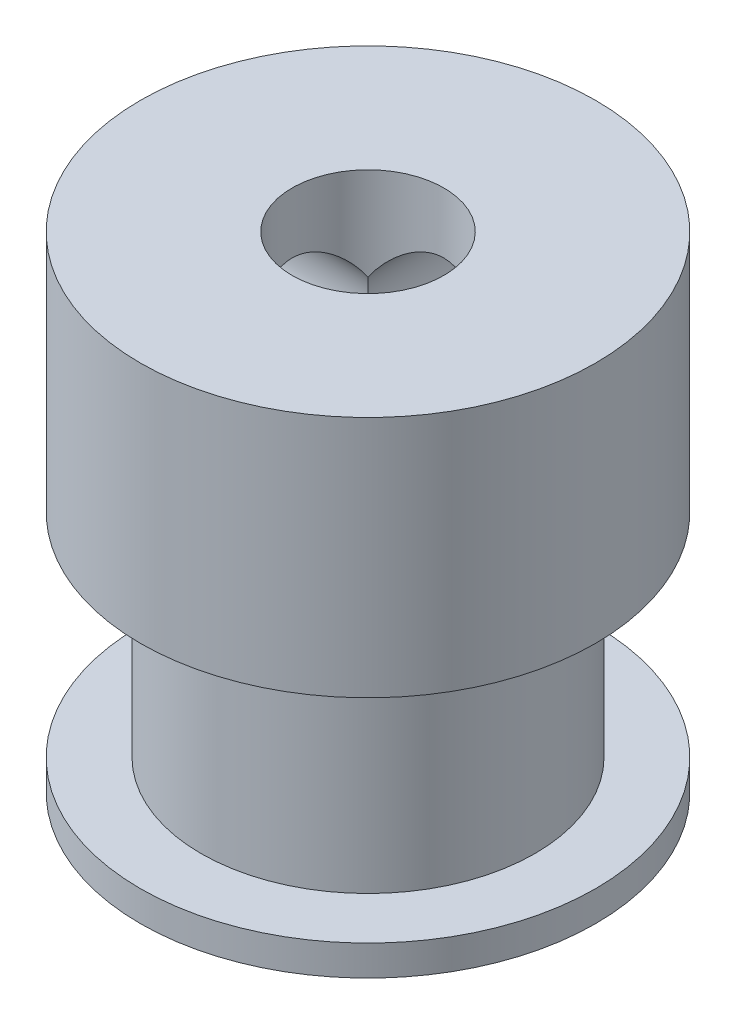
ISO-10303-21;
HEADER;
FILE_DESCRIPTION(('STEP AP214'),'2;1');
FILE_NAME('part.step','',(''),(''),'','','');
FILE_SCHEMA(('AUTOMOTIVE_DESIGN { 1 0 10303 214 1 1 1 1 }'));
ENDSEC;
DATA;
#1=APPLICATION_CONTEXT('core data for automotive mechanical design processes');
#2=APPLICATION_PROTOCOL_DEFINITION('international standard','automotive_design',2000,#1);
#3=PRODUCT_CONTEXT('',#1,'mechanical');
#4=PRODUCT('Part','Part','',(#3));
#5=PRODUCT_RELATED_PRODUCT_CATEGORY('part','',(#4));
#6=PRODUCT_DEFINITION_FORMATION('','',#4);
#7=PRODUCT_DEFINITION_CONTEXT('part definition',#1,'design');
#8=PRODUCT_DEFINITION('design','',#6,#7);
#9=PRODUCT_DEFINITION_SHAPE('','',#8);
#10=(LENGTH_UNIT() NAMED_UNIT(*) SI_UNIT(.MILLI.,.METRE.));
#11=(NAMED_UNIT(*) PLANE_ANGLE_UNIT() SI_UNIT($,.RADIAN.));
#12=(NAMED_UNIT(*) SI_UNIT($,.STERADIAN.) SOLID_ANGLE_UNIT());
#13=UNCERTAINTY_MEASURE_WITH_UNIT(LENGTH_MEASURE(1.E-05),#10,'distance_accuracy_value','');
#14=(GEOMETRIC_REPRESENTATION_CONTEXT(3) GLOBAL_UNCERTAINTY_ASSIGNED_CONTEXT((#13)) GLOBAL_UNIT_ASSIGNED_CONTEXT((#10,
#11,#12)) REPRESENTATION_CONTEXT('',''));
#15=CARTESIAN_POINT('',(0.,0.,0.));
#16=DIRECTION('',(0.,0.,1.));
#17=DIRECTION('',(1.,0.,0.));
#18=AXIS2_PLACEMENT_3D('',#15,#16,#17);
#19=CARTESIAN_POINT('',(0.,16.,0.));
#20=DIRECTION('',(0.,-1.,0.));
#21=DIRECTION('',(0.,0.,-1.));
#22=AXIS2_PLACEMENT_3D('',#19,#20,#21);
#23=CYLINDRICAL_SURFACE('',#22,7.5);
#24=CARTESIAN_POINT('',(0.,0.,0.));
#25=DIRECTION('',(0.,1.,0.));
#26=DIRECTION('',(0.,0.,1.));
#27=AXIS2_PLACEMENT_3D('',#24,#25,#26);
#28=CIRCLE('',#27,7.5);
#29=CARTESIAN_POINT('',(0.,0.,7.5));
#30=VERTEX_POINT('',#29);
#31=EDGE_CURVE('E72',#30,#30,#28,.T.);
#32=ORIENTED_EDGE('',*,*,#31,.T.);
#33=EDGE_LOOP('',(#32));
#34=FACE_BOUND('',#33,.T.);
#35=CARTESIAN_POINT('',(0.,1.,0.));
#36=DIRECTION('',(0.,-1.,0.));
#37=DIRECTION('',(0.,0.,-1.));
#38=AXIS2_PLACEMENT_3D('',#35,#36,#37);
#39=CIRCLE('',#38,7.5);
#40=CARTESIAN_POINT('',(0.,1.,-7.5));
#41=VERTEX_POINT('',#40);
#42=EDGE_CURVE('E102',#41,#41,#39,.T.);
#43=ORIENTED_EDGE('',*,*,#42,.T.);
#44=EDGE_LOOP('',(#43));
#45=FACE_BOUND('',#44,.T.);
#46=ADVANCED_FACE('F32',(#34,#45),#23,.T.);
#47=CARTESIAN_POINT('',(0.,0.,0.));
#48=DIRECTION('',(0.,1.,0.));
#49=DIRECTION('',(0.,0.,1.));
#50=AXIS2_PLACEMENT_3D('',#47,#48,#49);
#51=PLANE('',#50);
#52=CARTESIAN_POINT('',(0.,0.,0.));
#53=DIRECTION('',(0.,1.,0.));
#54=DIRECTION('',(0.,0.,1.));
#55=AXIS2_PLACEMENT_3D('',#52,#53,#54);
#56=CIRCLE('',#55,2.5);
#57=CARTESIAN_POINT('',(0.,0.,2.5));
#58=VERTEX_POINT('',#57);
#59=EDGE_CURVE('E88',#58,#58,#56,.T.);
#60=ORIENTED_EDGE('',*,*,#59,.T.);
#61=EDGE_LOOP('',(#60));
#62=FACE_BOUND('',#61,.T.);
#63=ORIENTED_EDGE('',*,*,#31,.F.);
#64=EDGE_LOOP('',(#63));
#65=FACE_BOUND('',#64,.T.);
#66=ADVANCED_FACE('F112',(#62,#65),#51,.F.);
#67=CARTESIAN_POINT('',(0.,1.,7.5));
#68=DIRECTION('',(0.,1.,0.));
#69=DIRECTION('',(0.,0.,1.));
#70=AXIS2_PLACEMENT_3D('',#67,#68,#69);
#71=PLANE('',#70);
#72=CARTESIAN_POINT('',(0.,1.,0.));
#73=DIRECTION('',(0.,-1.,0.));
#74=DIRECTION('',(0.,0.,-1.));
#75=AXIS2_PLACEMENT_3D('',#72,#73,#74);
#76=CIRCLE('',#75,5.5);
#77=CARTESIAN_POINT('',(0.,1.,-5.5));
#78=VERTEX_POINT('',#77);
#79=EDGE_CURVE('E99',#78,#78,#76,.T.);
#80=ORIENTED_EDGE('',*,*,#79,.T.);
#81=EDGE_LOOP('',(#80));
#82=FACE_BOUND('',#81,.T.);
#83=ORIENTED_EDGE('',*,*,#42,.F.);
#84=EDGE_LOOP('',(#83));
#85=FACE_BOUND('',#84,.T.);
#86=ADVANCED_FACE('F114',(#82,#85),#71,.T.);
#87=CARTESIAN_POINT('',(0.,0.,0.));
#88=DIRECTION('',(0.,-1.,0.));
#89=DIRECTION('',(0.,0.,-1.));
#90=AXIS2_PLACEMENT_3D('',#87,#88,#89);
#91=CYLINDRICAL_SURFACE('',#90,5.5);
#92=CARTESIAN_POINT('',(0.,8.,0.));
#93=DIRECTION('',(0.,-1.,0.));
#94=DIRECTION('',(0.,0.,-1.));
#95=AXIS2_PLACEMENT_3D('',#92,#93,#94);
#96=CIRCLE('',#95,5.5);
#97=CARTESIAN_POINT('',(0.,8.,-5.5));
#98=VERTEX_POINT('',#97);
#99=EDGE_CURVE('E96',#98,#98,#96,.T.);
#100=ORIENTED_EDGE('',*,*,#99,.T.);
#101=EDGE_LOOP('',(#100));
#102=FACE_BOUND('',#101,.T.);
#103=ORIENTED_EDGE('',*,*,#79,.F.);
#104=EDGE_LOOP('',(#103));
#105=FACE_BOUND('',#104,.T.);
#106=ADVANCED_FACE('F120',(#102,#105),#91,.T.);
#107=CARTESIAN_POINT('',(0.,8.,7.5));
#108=DIRECTION('',(0.,-1.,0.));
#109=DIRECTION('',(0.,0.,-1.));
#110=AXIS2_PLACEMENT_3D('',#107,#108,#109);
#111=PLANE('',#110);
#112=CARTESIAN_POINT('',(0.,8.,0.));
#113=DIRECTION('',(0.,-1.,0.));
#114=DIRECTION('',(0.,0.,-1.));
#115=AXIS2_PLACEMENT_3D('',#112,#113,#114);
#116=CIRCLE('',#115,7.5);
#117=CARTESIAN_POINT('',(0.,8.,-7.5));
#118=VERTEX_POINT('',#117);
#119=EDGE_CURVE('E91',#118,#118,#116,.T.);
#120=ORIENTED_EDGE('',*,*,#119,.T.);
#121=EDGE_LOOP('',(#120));
#122=FACE_BOUND('',#121,.T.);
#123=ORIENTED_EDGE('',*,*,#99,.F.);
#124=EDGE_LOOP('',(#123));
#125=FACE_BOUND('',#124,.T.);
#126=ADVANCED_FACE('F127',(#122,#125),#111,.T.);
#127=CARTESIAN_POINT('',(0.,16.,0.));
#128=DIRECTION('',(0.,1.,0.));
#129=DIRECTION('',(0.,0.,1.));
#130=AXIS2_PLACEMENT_3D('',#127,#128,#129);
#131=PLANE('',#130);
#132=CARTESIAN_POINT('',(0.,16.,0.));
#133=DIRECTION('',(0.,1.,0.));
#134=DIRECTION('',(0.,0.,1.));
#135=AXIS2_PLACEMENT_3D('',#132,#133,#134);
#136=CIRCLE('',#135,2.5);
#137=CARTESIAN_POINT('',(0.,16.,2.5));
#138=VERTEX_POINT('',#137);
#139=EDGE_CURVE('E62',#138,#138,#136,.T.);
#140=ORIENTED_EDGE('',*,*,#139,.F.);
#141=EDGE_LOOP('',(#140));
#142=FACE_BOUND('',#141,.T.);
#143=CARTESIAN_POINT('',(0.,16.,0.));
#144=DIRECTION('',(0.,1.,0.));
#145=DIRECTION('',(0.,0.,1.));
#146=AXIS2_PLACEMENT_3D('',#143,#144,#145);
#147=CIRCLE('',#146,7.5);
#148=CARTESIAN_POINT('',(0.,16.,7.5));
#149=VERTEX_POINT('',#148);
#150=EDGE_CURVE('E40',#149,#149,#147,.T.);
#151=ORIENTED_EDGE('',*,*,#150,.T.);
#152=EDGE_LOOP('',(#151));
#153=FACE_BOUND('',#152,.T.);
#154=ADVANCED_FACE('F125',(#142,#153),#131,.T.);
#155=CARTESIAN_POINT('',(-7.50000000000003,10.,0.));
#156=CARTESIAN_POINT('',(-7.49999833810164,10.0000026169349,-0.110254555832828));
#157=CARTESIAN_POINT('',(-7.49754486162152,10.0091476141897,-0.220537160221813));
#158=CARTESIAN_POINT('',(-7.48799573621659,10.0454212307387,-0.437925451354436));
#159=CARTESIAN_POINT('',(-7.48089785332586,10.0725585044261,-0.545029583319059));
#160=CARTESIAN_POINT('',(-7.46284333252791,10.143871666864,-0.752891589045285));
#161=CARTESIAN_POINT('',(-7.45189167130376,10.188025587666,-0.853657451015257));
#162=CARTESIAN_POINT('',(-7.42728699151678,10.2920372426666,-1.04635368639263));
#163=CARTESIAN_POINT('',(-7.4136337929518,10.3518960233593,-1.1382834704496));
#164=CARTESIAN_POINT('',(-7.38474614901995,10.4870835164134,-1.31282950373999));
#165=CARTESIAN_POINT('',(-7.36948467678682,10.5627086680083,-1.39521168986276));
#166=CARTESIAN_POINT('',(-7.33927409679592,10.7266484830634,-1.54628713660635));
#167=CARTESIAN_POINT('',(-7.32432502947244,10.8149647776175,-1.61497863495662));
#168=CARTESIAN_POINT('',(-7.29615537464373,11.0036482348254,-1.73786409243412));
#169=CARTESIAN_POINT('',(-7.28296888563239,11.1041963282617,-1.79178877736485));
#170=CARTESIAN_POINT('',(-7.26021477318188,11.3133401110924,-1.88187548076991));
#171=CARTESIAN_POINT('',(-7.25064648253265,11.4219343123314,-1.91804077451366));
#172=CARTESIAN_POINT('',(-7.236491158024,11.641495537825,-1.97076920226501));
#173=CARTESIAN_POINT('',(-7.23179647811491,11.7523535399307,-1.98775670244689));
#174=CARTESIAN_POINT('',(-7.22759830916371,11.9754376833065,-2.00297034705817));
#175=CARTESIAN_POINT('',(-7.22809385014446,12.0876635650241,-2.00119999705751));
#176=CARTESIAN_POINT('',(-7.23412378802031,12.3069854153741,-1.97928510002697));
#177=CARTESIAN_POINT('',(-7.23951735511532,12.4141371820385,-1.95965406064762));
#178=CARTESIAN_POINT('',(-7.25451013080689,12.6235683344562,-1.9033974872218));
#179=CARTESIAN_POINT('',(-7.26410967552613,12.7258473300753,-1.86677059492992));
#180=CARTESIAN_POINT('',(-7.28655661748387,12.9239681438086,-1.77714356965253));
#181=CARTESIAN_POINT('',(-7.29943942818704,13.0197243392863,-1.72396341137782));
#182=CARTESIAN_POINT('',(-7.32698229642445,13.2011341588515,-1.60286503823775));
#183=CARTESIAN_POINT('',(-7.34164270355187,13.2867857891565,-1.53494392224249));
#184=CARTESIAN_POINT('',(-7.37167510629864,13.4484889974548,-1.38366607263417));
#185=CARTESIAN_POINT('',(-7.38705471488831,13.5241363183149,-1.29987812728297));
#186=CARTESIAN_POINT('',(-7.41636381276316,13.6603887803503,-1.12061766820635));
#187=CARTESIAN_POINT('',(-7.43029324488555,13.7209933287024,-1.02514469420507));
#188=CARTESIAN_POINT('',(-7.45521820398294,13.8256179028246,-0.824598255497428));
#189=CARTESIAN_POINT('',(-7.4662007283356,13.8695647704486,-0.719484902551765));
#190=CARTESIAN_POINT('',(-7.48390044401,13.9390471888134,-0.503002294390372));
#191=CARTESIAN_POINT('',(-7.49061856733749,13.964586762724,-0.3916344119283));
#192=CARTESIAN_POINT('',(-7.49889158558384,13.9958948769178,-0.169254083145492));
#193=CARTESIAN_POINT('',(-7.50058997470959,14.0022130398509,-0.0583242376413571));
#194=CARTESIAN_POINT('',(-7.49904471691695,13.9964168357531,0.163010045901222));
#195=CARTESIAN_POINT('',(-7.49580158080353,13.9843043738942,0.273414537062138));
#196=CARTESIAN_POINT('',(-7.48483035496021,13.94244155254,0.488602449901804));
#197=CARTESIAN_POINT('',(-7.47718026546329,13.9129977538022,0.593449852027806));
#198=CARTESIAN_POINT('',(-7.45826294894139,13.8376640554921,0.796706971176088));
#199=CARTESIAN_POINT('',(-7.44699532996161,13.7917723737495,0.895115989216051));
#200=CARTESIAN_POINT('',(-7.42175660559528,13.6838261128195,1.08483847466798));
#201=CARTESIAN_POINT('',(-7.40773686604956,13.6214725332023,1.17597518846121));
#202=CARTESIAN_POINT('',(-7.37861452365563,13.482748369842,1.34668463539717));
#203=CARTESIAN_POINT('',(-7.3635117072752,13.4063750173989,1.4262550787992));
#204=CARTESIAN_POINT('',(-7.33339745866704,13.2392144225054,1.57388924478776));
#205=CARTESIAN_POINT('',(-7.31840061429312,13.1480814386048,1.64156519249818));
#206=CARTESIAN_POINT('',(-7.29066447182727,12.9554353039004,1.76067191185121));
#207=CARTESIAN_POINT('',(-7.27792507956316,12.8539225863777,1.81210336122163));
#208=CARTESIAN_POINT('',(-7.25629268373209,12.6439046929239,1.89687411586115));
#209=CARTESIAN_POINT('',(-7.24737748318008,12.5354441881824,1.9303181225396));
#210=CARTESIAN_POINT('',(-7.234398251268,12.3141606803253,1.97841205118793));
#211=CARTESIAN_POINT('',(-7.23033298020014,12.2013387996521,1.9930667760248));
#212=CARTESIAN_POINT('',(-7.22761744573588,11.9785052121162,2.00288989653717));
#213=CARTESIAN_POINT('',(-7.22879397743238,11.8685226797417,1.99868155618111));
#214=CARTESIAN_POINT('',(-7.23602396081087,11.65089648599,1.97234376000441));
#215=CARTESIAN_POINT('',(-7.24207728699438,11.5432527644994,1.95021476535028));
#216=CARTESIAN_POINT('',(-7.25827571073158,11.3341442478702,1.88902515699702));
#217=CARTESIAN_POINT('',(-7.26838885019644,11.2326381572678,1.85009661075583));
#218=CARTESIAN_POINT('',(-7.29156818136177,11.0375211694659,1.75651554562389));
#219=CARTESIAN_POINT('',(-7.30463483621363,10.9439115136995,1.70186056024619));
#220=CARTESIAN_POINT('',(-7.3327292144046,10.7642696405034,1.57648909268819));
#221=CARTESIAN_POINT('',(-7.3478033310169,10.6785414650238,1.50534729767912));
#222=CARTESIAN_POINT('',(-7.37795503783007,10.5200375483327,1.34983053511103));
#223=CARTESIAN_POINT('',(-7.3930326279844,10.4472649613312,1.26545235435877));
#224=CARTESIAN_POINT('',(-7.42187812403968,10.3152077623531,1.08367998108871));
#225=CARTESIAN_POINT('',(-7.4356111131455,10.2562449893507,0.986045961751808));
#226=CARTESIAN_POINT('',(-7.45983810102897,10.1556625840706,0.781888640416917));
#227=CARTESIAN_POINT('',(-7.47033417683594,10.1140318243364,0.675371094696325));
#228=CARTESIAN_POINT('',(-7.48554752513467,10.0547247145845,0.474374704881018));
#229=CARTESIAN_POINT('',(-7.49092770592601,10.0342506164075,0.380762016565062));
#230=CARTESIAN_POINT('',(-7.49815449036457,10.0068877938329,0.191439795317102));
#231=CARTESIAN_POINT('',(-7.50000144297273,9.99999772779998,0.0957304704048863));
#232=CARTESIAN_POINT('',(-7.50000000000003,10.,0.));
#233=B_SPLINE_CURVE_WITH_KNOTS('',3,(#155,#156,#157,#158,#159,#160,#161,#162,#163,#164,#165,
#166,#167,#168,#169,#170,#171,#172,#173,#174,#175,#176,#177,#178,#179,#180,#181,#182,#183,#184,
#185,#186,#187,#188,#189,#190,#191,#192,#193,#194,#195,#196,#197,#198,#199,#200,#201,#202,#203,
#204,#205,#206,#207,#208,#209,#210,#211,#212,#213,#214,#215,#216,#217,#218,#219,#220,#221,#222,
#223,#224,#225,#226,#227,#228,#229,#230,#231,#232),.UNSPECIFIED.,.T.,.F.,(4,2,2,2,2,2,2,2,2,2,2,
2,2,2,2,2,2,2,2,2,2,2,2,2,2,2,2,2,2,2,2,2,2,2,2,2,2,2,4),(0.,0.330412598949568,
0.660984243761449,0.991130552971931,1.32129886708675,1.65834897954967,1.99544244925149,
2.33832582523229,2.68114594129699,3.01622158250468,3.35123460404319,3.67691002045997,
4.0026114681294,4.33198673346498,4.6614268811763,5.00161259812322,5.34181171937597,
5.68348809603041,6.02508977190138,6.35682717524547,6.6885302892535,7.01453535642116,
7.34057575775614,7.6730028600455,8.00549568258887,8.34736496382788,8.68921998024107,
9.02906297699386,9.36881908663983,9.69743342403611,10.0260393052059,10.352107654483,
10.67822717123,11.0139433957139,11.3497412433245,11.692722522809,12.0354832614518,
12.3223981899334,12.6092847796638),.UNSPECIFIED.);
#234=CARTESIAN_POINT('',(-7.50000000000003,10.,0.));
#235=VERTEX_POINT('',#234);
#236=EDGE_CURVE('E56',#235,#235,#233,.T.);
#237=ORIENTED_EDGE('',*,*,#236,.T.);
#238=EDGE_LOOP('',(#237));
#239=FACE_BOUND('',#238,.T.);
#240=CARTESIAN_POINT('',(0.,14.,-7.5));
#241=CARTESIAN_POINT('',(-0.110254555832854,13.9999973830651,-7.49999833810162));
#242=CARTESIAN_POINT('',(-0.22053716022184,13.9908523858103,-7.49754486162151));
#243=CARTESIAN_POINT('',(-0.437925451354463,13.9545787692613,-7.4879957362166));
#244=CARTESIAN_POINT('',(-0.545029583319086,13.9274414955739,-7.48089785332586));
#245=CARTESIAN_POINT('',(-0.752891589045312,13.856128333136,-7.46284333252791));
#246=CARTESIAN_POINT('',(-0.853657451015285,13.811974412334,-7.45189167130375));
#247=CARTESIAN_POINT('',(-1.04635368639266,13.7079627573334,-7.42728699151678));
#248=CARTESIAN_POINT('',(-1.13828347044963,13.6481039766407,-7.4136337929518));
#249=CARTESIAN_POINT('',(-1.31282950374002,13.5129164835866,-7.38474614901995));
#250=CARTESIAN_POINT('',(-1.39521168986279,13.4372913319917,-7.36948467678681));
#251=CARTESIAN_POINT('',(-1.54628713660638,13.2733515169366,-7.33927409679591));
#252=CARTESIAN_POINT('',(-1.61497863495664,13.1850352223825,-7.32432502947243));
#253=CARTESIAN_POINT('',(-1.73786409243415,12.9963517651746,-7.29615537464372));
#254=CARTESIAN_POINT('',(-1.79178877736487,12.8958036717383,-7.28296888563239));
#255=CARTESIAN_POINT('',(-1.88187548076994,12.6866598889076,-7.26021477318187));
#256=CARTESIAN_POINT('',(-1.91804077451369,12.5780656876686,-7.25064648253265));
#257=CARTESIAN_POINT('',(-1.97076920226504,12.358504462175,-7.23649115802399));
#258=CARTESIAN_POINT('',(-1.98775670244692,12.2476464600693,-7.2317964781149));
#259=CARTESIAN_POINT('',(-2.0029703470582,12.0245623166935,-7.22759830916371));
#260=CARTESIAN_POINT('',(-2.00119999705753,11.9123364349759,-7.22809385014446));
#261=CARTESIAN_POINT('',(-1.97928510002699,11.6930145846259,-7.23412378802031));
#262=CARTESIAN_POINT('',(-1.95965406064765,11.5858628179615,-7.23951735511531));
#263=CARTESIAN_POINT('',(-1.90339748722183,11.3764316655438,-7.25451013080688));
#264=CARTESIAN_POINT('',(-1.86677059492995,11.2741526699247,-7.26410967552613));
#265=CARTESIAN_POINT('',(-1.77714356965256,11.0760318561914,-7.28655661748386));
#266=CARTESIAN_POINT('',(-1.72396341137784,10.9802756607137,-7.29943942818703));
#267=CARTESIAN_POINT('',(-1.60286503823777,10.7988658411485,-7.32698229642445));
#268=CARTESIAN_POINT('',(-1.53494392224251,10.7132142108435,-7.34164270355186));
#269=CARTESIAN_POINT('',(-1.38366607263419,10.5515110025452,-7.37167510629864));
#270=CARTESIAN_POINT('',(-1.29987812728299,10.475863681685,-7.38705471488831));
#271=CARTESIAN_POINT('',(-1.12061766820637,10.3396112196497,-7.41636381276316));
#272=CARTESIAN_POINT('',(-1.02514469420509,10.2790066712976,-7.43029324488555));
#273=CARTESIAN_POINT('',(-0.824598255497451,10.1743820971754,-7.45521820398293));
#274=CARTESIAN_POINT('',(-0.719484902551789,10.1304352295514,-7.4662007283356));
#275=CARTESIAN_POINT('',(-0.503002294390395,10.0609528111866,-7.48390044400999));
#276=CARTESIAN_POINT('',(-0.391634411928323,10.035413237276,-7.49061856733749));
#277=CARTESIAN_POINT('',(-0.169254083145515,10.0041051230822,-7.49889158558384));
#278=CARTESIAN_POINT('',(-0.0583242376413801,9.99778696014913,-7.50058997470959));
#279=CARTESIAN_POINT('',(0.163010045901199,10.0035831642469,-7.49904471691695));
#280=CARTESIAN_POINT('',(0.273414537062114,10.0156956261058,-7.49580158080353));
#281=CARTESIAN_POINT('',(0.48860244990178,10.05755844746,-7.48483035496021));
#282=CARTESIAN_POINT('',(0.593449852027783,10.0870022461978,-7.4771802654633));
#283=CARTESIAN_POINT('',(0.796706971176065,10.1623359445079,-7.45826294894139));
#284=CARTESIAN_POINT('',(0.895115989216027,10.2082276262505,-7.44699532996161));
#285=CARTESIAN_POINT('',(1.08483847466795,10.3161738871805,-7.42175660559529));
#286=CARTESIAN_POINT('',(1.17597518846118,10.3785274667977,-7.40773686604957));
#287=CARTESIAN_POINT('',(1.34668463539715,10.517251630158,-7.37861452365564));
#288=CARTESIAN_POINT('',(1.42625507879918,10.5936249826011,-7.3635117072752));
#289=CARTESIAN_POINT('',(1.57388924478774,10.7607855774946,-7.33339745866705));
#290=CARTESIAN_POINT('',(1.64156519249816,10.8519185613952,-7.31840061429312));
#291=CARTESIAN_POINT('',(1.76067191185118,11.0445646960996,-7.29066447182728));
#292=CARTESIAN_POINT('',(1.81210336122161,11.1460774136223,-7.27792507956316));
#293=CARTESIAN_POINT('',(1.89687411586112,11.3560953070761,-7.2562926837321));
#294=CARTESIAN_POINT('',(1.93031812253958,11.4645558118176,-7.24737748318009));
#295=CARTESIAN_POINT('',(1.97841205118791,11.6858393196748,-7.23439825126801));
#296=CARTESIAN_POINT('',(1.99306677602478,11.7986612003479,-7.23033298020014));
#297=CARTESIAN_POINT('',(2.00288989653714,12.0214947878838,-7.22761744573589));
#298=CARTESIAN_POINT('',(1.99868155618109,12.1314773202583,-7.22879397743239));
#299=CARTESIAN_POINT('',(1.97234376000439,12.34910351401,-7.23602396081087));
#300=CARTESIAN_POINT('',(1.95021476535025,12.4567472355006,-7.24207728699439));
#301=CARTESIAN_POINT('',(1.88902515699699,12.6658557521298,-7.25827571073158));
#302=CARTESIAN_POINT('',(1.8500966107558,12.7673618427322,-7.26838885019644));
#303=CARTESIAN_POINT('',(1.75651554562386,12.9624788305341,-7.29156818136178));
#304=CARTESIAN_POINT('',(1.70186056024617,13.0560884863005,-7.30463483621364));
#305=CARTESIAN_POINT('',(1.57648909268817,13.2357303594966,-7.3327292144046));
#306=CARTESIAN_POINT('',(1.50534729767909,13.3214585349762,-7.3478033310169));
#307=CARTESIAN_POINT('',(1.349830535111,13.4799624516673,-7.37795503783008));
#308=CARTESIAN_POINT('',(1.26545235435875,13.5527350386688,-7.39303262798441));
#309=CARTESIAN_POINT('',(1.08367998108868,13.6847922376469,-7.42187812403969));
#310=CARTESIAN_POINT('',(0.986045961751779,13.7437550106493,-7.43561111314551));
#311=CARTESIAN_POINT('',(0.781888640416889,13.8443374159294,-7.45983810102898));
#312=CARTESIAN_POINT('',(0.675371094696296,13.8859681756636,-7.47033417683594));
#313=CARTESIAN_POINT('',(0.47437470488099,13.9452752854155,-7.48554752513468));
#314=CARTESIAN_POINT('',(0.380762016565036,13.9657493835925,-7.49092770592602));
#315=CARTESIAN_POINT('',(0.191439795317076,13.9931122061671,-7.49815449036456));
#316=CARTESIAN_POINT('',(0.0957304704048603,14.0000022722,-7.5000014429727));
#317=CARTESIAN_POINT('',(0.,14.,-7.5));
#318=B_SPLINE_CURVE_WITH_KNOTS('',3,(#240,#241,#242,#243,#244,#245,#246,#247,#248,#249,#250,
#251,#252,#253,#254,#255,#256,#257,#258,#259,#260,#261,#262,#263,#264,#265,#266,#267,#268,#269,
#270,#271,#272,#273,#274,#275,#276,#277,#278,#279,#280,#281,#282,#283,#284,#285,#286,#287,#288,
#289,#290,#291,#292,#293,#294,#295,#296,#297,#298,#299,#300,#301,#302,#303,#304,#305,#306,#307,
#308,#309,#310,#311,#312,#313,#314,#315,#316,#317),.UNSPECIFIED.,.T.,.F.,(4,2,2,2,2,2,2,2,2,2,2,
2,2,2,2,2,2,2,2,2,2,2,2,2,2,2,2,2,2,2,2,2,2,2,2,2,2,2,4),(0.,0.330412598949569,0.66098424376145,
0.991130552971932,1.32129886708675,1.65834897954967,1.99544244925149,2.33832582523229,
2.681145941297,3.01622158250468,3.3512346040432,3.67691002045997,4.0026114681294,
4.33198673346498,4.6614268811763,5.00161259812322,5.34181171937597,5.68348809603041,
6.02508977190139,6.35682717524547,6.68853028925351,7.01453535642116,7.34057575775614,
7.6730028600455,8.00549568258887,8.34736496382789,8.68921998024107,9.02906297699387,
9.36881908663983,9.69743342403611,10.0260393052059,10.352107654483,10.67822717123,
11.0139433957139,11.3497412433245,11.692722522809,12.0354832614518,12.3223981899334,
12.6092847796638),.UNSPECIFIED.);
#319=CARTESIAN_POINT('',(0.,14.,-7.5));
#320=VERTEX_POINT('',#319);
#321=EDGE_CURVE('E60',#320,#320,#318,.T.);
#322=ORIENTED_EDGE('',*,*,#321,.T.);
#323=EDGE_LOOP('',(#322));
#324=FACE_BOUND('',#323,.T.);
#325=ORIENTED_EDGE('',*,*,#150,.F.);
#326=EDGE_LOOP('',(#325));
#327=FACE_BOUND('',#326,.T.);
#328=ORIENTED_EDGE('',*,*,#119,.F.);
#329=EDGE_LOOP('',(#328));
#330=FACE_BOUND('',#329,.T.);
#331=ADVANCED_FACE('F123',(#239,#324,#327,#330),#23,.T.);
#332=CARTESIAN_POINT('',(0.,0.,0.));
#333=DIRECTION('',(0.,1.,0.));
#334=DIRECTION('',(0.,0.,1.));
#335=AXIS2_PLACEMENT_3D('',#332,#333,#334);
#336=CYLINDRICAL_SURFACE('',#335,2.5);
#337=CARTESIAN_POINT('',(2.,12.,-1.5));
#338=CARTESIAN_POINT('',(1.9999899563842,11.9249189826114,-1.5000227575991));
#339=CARTESIAN_POINT('',(1.99572243014959,11.8497210739064,-1.50575588676017));
#340=CARTESIAN_POINT('',(1.97904350434638,11.7016854705704,-1.52759797098302));
#341=CARTESIAN_POINT('',(1.96660415938922,11.6288567781879,-1.54374252679463));
#342=CARTESIAN_POINT('',(1.9288828901246,11.4623945804914,-1.59078313764401));
#343=CARTESIAN_POINT('',(1.90063587852784,11.3703574929004,-1.62485949442395));
#344=CARTESIAN_POINT('',(1.83286412912234,11.1940318598387,-1.70094533012843));
#345=CARTESIAN_POINT('',(1.79330760683741,11.1097660503329,-1.74297705283046));
#346=CARTESIAN_POINT('',(1.68777756612173,10.9196603432195,-1.84624966659378));
#347=CARTESIAN_POINT('',(1.6174236371176,10.8170334258727,-1.90894188114929));
#348=CARTESIAN_POINT('',(1.45861935064739,10.6260231647878,-2.03287996747903));
#349=CARTESIAN_POINT('',(1.37018407682201,10.5376280578861,-2.0941269976447));
#350=CARTESIAN_POINT('',(1.19476026278806,10.3928950804225,-2.1979067439451));
#351=CARTESIAN_POINT('',(1.11093376146689,10.3336737173159,-2.24174680788007));
#352=CARTESIAN_POINT('',(0.932444755507561,10.2276340400337,-2.32165152523267));
#353=CARTESIAN_POINT('',(0.837799422094948,10.1807964517991,-2.35772824500368));
#354=CARTESIAN_POINT('',(0.655317082222546,10.1082870394193,-2.41415644696378));
#355=CARTESIAN_POINT('',(0.568853585755693,10.0804174354239,-2.43610736091393));
#356=CARTESIAN_POINT('',(0.391188052921989,10.036501304746,-2.47085912284979));
#357=CARTESIAN_POINT('',(0.29998863731262,10.02044831209,-2.48366497483986));
#358=CARTESIAN_POINT('',(0.115048335136525,10.0011419067099,-2.49907968883617));
#359=CARTESIAN_POINT('',(0.0212997713726984,9.99793280731136,-2.50165324772141));
#360=CARTESIAN_POINT('',(-0.165416366428143,10.0046642348722,-2.49626936144757));
#361=CARTESIAN_POINT('',(-0.258383904122235,10.0146053703685,-2.48831142893578));
#362=CARTESIAN_POINT('',(-0.4356835684361,10.046067986313,-2.4632836571348));
#363=CARTESIAN_POINT('',(-0.520210188917501,10.0669288169561,-2.44673404857181));
#364=CARTESIAN_POINT('',(-0.684171862172428,10.1186952342522,-2.40604493660584));
#365=CARTESIAN_POINT('',(-0.763605624129772,10.1496033554976,-2.38190351809567));
#366=CARTESIAN_POINT('',(-0.923527318234434,10.2236006985885,-2.32486221996811));
#367=CARTESIAN_POINT('',(-1.00337969293305,10.2675765160147,-2.29134265660255));
#368=CARTESIAN_POINT('',(-1.15470891362336,10.3645378595917,-2.21894043646479));
#369=CARTESIAN_POINT('',(-1.22618103296473,10.4175284293631,-2.18005477975511));
#370=CARTESIAN_POINT('',(-1.37426521356107,10.5430618687988,-2.09053510980241));
#371=CARTESIAN_POINT('',(-1.44890108738507,10.6173836142049,-2.03913144290366));
#372=CARTESIAN_POINT('',(-1.58538384993671,10.7762559036507,-1.9349237792571));
#373=CARTESIAN_POINT('',(-1.6472149443604,10.8608188786743,-1.88211814269102));
#374=CARTESIAN_POINT('',(-1.75228528490804,11.0312201958179,-1.78441317626436));
#375=CARTESIAN_POINT('',(-1.79674173995946,11.1161509405137,-1.73924224553799));
#376=CARTESIAN_POINT('',(-1.87389106987978,11.2943664663345,-1.65582105773209));
#377=CARTESIAN_POINT('',(-1.90660965872838,11.3876324203376,-1.61755576516689));
#378=CARTESIAN_POINT('',(-1.95062199735974,11.5527916040278,-1.56393805143324));
#379=CARTESIAN_POINT('',(-1.96540293714784,11.6226128308979,-1.54515601955456));
#380=CARTESIAN_POINT('',(-1.98746978122375,11.7651802059541,-1.51667304681101));
#381=CARTESIAN_POINT('',(-1.99477239579985,11.8379194539107,-1.50695186390373));
#382=CARTESIAN_POINT('',(-2.0012999442642,11.9848633779274,-1.49827790293909));
#383=CARTESIAN_POINT('',(-2.00047806264257,12.0590740850574,-1.49938753445573));
#384=CARTESIAN_POINT('',(-1.99072610261057,12.2060473250374,-1.51230456185753));
#385=CARTESIAN_POINT('',(-1.98178458332098,12.2788076663875,-1.52412705251965));
#386=CARTESIAN_POINT('',(-1.95331430449203,12.4390632026618,-1.56051508430773));
#387=CARTESIAN_POINT('',(-1.9316709289088,12.5255982681308,-1.58755721486228));
#388=CARTESIAN_POINT('',(-1.87841388450525,12.6922908660855,-1.65022809339808));
#389=CARTESIAN_POINT('',(-1.84677049067316,12.7724284809031,-1.6858823654909));
#390=CARTESIAN_POINT('',(-1.75807608919816,12.9615289293493,-1.77903249993889));
#391=CARTESIAN_POINT('',(-1.69602510944931,13.0668953343252,-1.83905564347524));
#392=CARTESIAN_POINT('',(-1.55438039564657,13.264384149242,-1.96026853157684));
#393=CARTESIAN_POINT('',(-1.47476601547361,13.3564907596835,-2.0214595710443));
#394=CARTESIAN_POINT('',(-1.29702304107541,13.527462807345,-2.13993299259158));
#395=CARTESIAN_POINT('',(-1.19864860522963,13.6061226291131,-2.19714788259661));
#396=CARTESIAN_POINT('',(-0.984970277741316,13.7452665274442,-2.30083046289375));
#397=CARTESIAN_POINT('',(-0.869723203455188,13.8058096056706,-2.34733292440641));
#398=CARTESIAN_POINT('',(-0.66453199414097,13.8884905874669,-2.41163161860483));
#399=CARTESIAN_POINT('',(-0.578408265123332,13.9167173769741,-2.43384921549886));
#400=CARTESIAN_POINT('',(-0.401365381235629,13.961432134964,-2.46921550391513));
#401=CARTESIAN_POINT('',(-0.310449944179056,13.9779290645406,-2.48237111815073));
#402=CARTESIAN_POINT('',(-0.1259613580523,13.9981928241047,-2.49854699723995));
#403=CARTESIAN_POINT('',(-0.0323797561454452,14.0019132050583,-2.50153028039159));
#404=CARTESIAN_POINT('',(0.154129494971558,13.9962334907348,-2.4969871999336));
#405=CARTESIAN_POINT('',(0.247057097671193,13.9868324715917,-2.48946009629711));
#406=CARTESIAN_POINT('',(0.42448498330785,13.9563964529088,-2.46524008405095));
#407=CARTESIAN_POINT('',(0.509170159101621,13.9360106685972,-2.449059003061));
#408=CARTESIAN_POINT('',(0.673520542356751,13.8851465786865,-2.4090520196301));
#409=CARTESIAN_POINT('',(0.753184443303532,13.854665659174,-2.38522413726749));
#410=CARTESIAN_POINT('',(0.913383591851874,13.7816254556074,-2.32886203207213));
#411=CARTESIAN_POINT('',(0.993310088153979,13.738206157889,-2.29572397002091));
#412=CARTESIAN_POINT('',(1.14486396126306,13.6423576629054,-2.22403396009592));
#413=CARTESIAN_POINT('',(1.21648689776309,13.5899236819315,-2.18547913977515));
#414=CARTESIAN_POINT('',(1.36488223995398,13.4657037869963,-2.09666852429869));
#415=CARTESIAN_POINT('',(1.43970803793641,13.3921535866846,-2.04563299169992));
#416=CARTESIAN_POINT('',(1.57669353079991,13.2348830744766,-1.94201312920059));
#417=CARTESIAN_POINT('',(1.63883728583054,13.1511501723947,-1.88942694411833));
#418=CARTESIAN_POINT('',(1.74551261366341,12.9810424554704,-1.7910912532181));
#419=CARTESIAN_POINT('',(1.79106140064659,12.8954274787839,-1.74513263017547));
#420=CARTESIAN_POINT('',(1.87016304685231,12.7156081117486,-1.66007449903138));
#421=CARTESIAN_POINT('',(1.90373836359645,12.6214202219623,-1.6209622208173));
#422=CARTESIAN_POINT('',(1.94914139922438,12.4538606732473,-1.56580101941138));
#423=CARTESIAN_POINT('',(1.96446470848963,12.3825804555928,-1.54635220628733));
#424=CARTESIAN_POINT('',(1.98726282623961,12.2369757290291,-1.51695472225641));
#425=CARTESIAN_POINT('',(1.99476751139893,12.1626639447221,-1.50696990066825));
#426=CARTESIAN_POINT('',(1.99935742227831,12.0586747856577,-1.50085460132402));
#427=CARTESIAN_POINT('',(2.00000392566845,12.0293463217565,-1.49999110491774));
#428=CARTESIAN_POINT('',(2.,12.,-1.5));
#429=B_SPLINE_CURVE_WITH_KNOTS('',3,(#337,#338,#339,#340,#341,#342,#343,#344,#345,#346,#347,
#348,#349,#350,#351,#352,#353,#354,#355,#356,#357,#358,#359,#360,#361,#362,#363,#364,#365,#366,
#367,#368,#369,#370,#371,#372,#373,#374,#375,#376,#377,#378,#379,#380,#381,#382,#383,#384,#385,
#386,#387,#388,#389,#390,#391,#392,#393,#394,#395,#396,#397,#398,#399,#400,#401,#402,#403,#404,
#405,#406,#407,#408,#409,#410,#411,#412,#413,#414,#415,#416,#417,#418,#419,#420,#421,#422,#423,
#424,#425,#426,#427,#428),.UNSPECIFIED.,.T.,.F.,(4,2,2,2,2,2,2,2,2,2,2,2,2,2,2,2,2,2,2,2,2,2,2,
2,2,2,2,2,2,2,2,2,2,2,2,2,2,2,2,2,2,2,2,2,2,4),(0.,0.225140818813293,0.451055593895018,
0.755714384660881,1.06123795594964,1.47720804611674,1.8928325353688,2.22639303179098,
2.55943127851025,2.83862094435178,3.11765772560939,3.39765639927928,3.67766803055209,
3.94241917501297,4.20723715914625,4.49756510688428,4.78805602626152,5.13841226546405,
5.48919811771067,5.80619193384967,6.12248701337037,6.34307726284838,6.56317352160417,
6.78453876949456,7.00621641426759,7.28428560377195,7.56318925297414,7.96975811975668,
8.37680748728572,8.78961174948154,9.20105660259845,9.47985927613152,9.75844872724253,
10.0380499218877,10.3176708039936,10.5823344198312,10.8470666181456,11.1364335884202,
11.4259545900794,11.7747351905783,12.1239515037794,12.4449574092071,12.7653580273015,
12.9909138326702,13.2156045429056,13.3036035490356),.UNSPECIFIED.);
#430=CARTESIAN_POINT('',(-1.76776695296637,12.9354143466935,-1.76776695296637));
#431=VERTEX_POINT('',#430);
#432=CARTESIAN_POINT('',(-1.76776695296895,11.0645856533037,-1.76776695296395));
#433=VERTEX_POINT('',#432);
#434=EDGE_CURVE('E55',#431,#433,#429,.T.);
#435=ORIENTED_EDGE('',*,*,#434,.T.);
#436=CARTESIAN_POINT('',(-1.50000000000001,12.,-1.99999999999999));
#437=CARTESIAN_POINT('',(-1.50002275759911,11.9249189826114,-1.99998995638419));
#438=CARTESIAN_POINT('',(-1.50575588676017,11.8497210739064,-1.99572243014958));
#439=CARTESIAN_POINT('',(-1.52759797098302,11.7016854705704,-1.97904350434638));
#440=CARTESIAN_POINT('',(-1.54374252679464,11.6288567781879,-1.96660415938922));
#441=CARTESIAN_POINT('',(-1.59078313764402,11.4623945804914,-1.92888289012459));
#442=CARTESIAN_POINT('',(-1.62485949442395,11.3703574929005,-1.90063587852783));
#443=CARTESIAN_POINT('',(-1.70094533012843,11.1940318598387,-1.83286412912234));
#444=CARTESIAN_POINT('',(-1.74297705283046,11.1097660503329,-1.7933076068374));
#445=CARTESIAN_POINT('',(-1.84624966659379,10.9196603432195,-1.68777756612172));
#446=CARTESIAN_POINT('',(-1.9089418811493,10.8170334258727,-1.6174236371176));
#447=CARTESIAN_POINT('',(-2.03287996747903,10.6260231647878,-1.45861935064739));
#448=CARTESIAN_POINT('',(-2.09412699764471,10.5376280578861,-1.370184076822));
#449=CARTESIAN_POINT('',(-2.19790674394511,10.3928950804225,-1.19476026278806));
#450=CARTESIAN_POINT('',(-2.24174680788008,10.3336737173159,-1.11093376146688));
#451=CARTESIAN_POINT('',(-2.32165152523268,10.2276340400337,-0.932444755507556));
#452=CARTESIAN_POINT('',(-2.35772824500368,10.1807964517991,-0.837799422094943));
#453=CARTESIAN_POINT('',(-2.41415644696378,10.1082870394193,-0.655317082222541));
#454=CARTESIAN_POINT('',(-2.43610736091393,10.0804174354239,-0.568853585755687));
#455=CARTESIAN_POINT('',(-2.47085912284979,10.036501304746,-0.391188052921983));
#456=CARTESIAN_POINT('',(-2.48366497483986,10.02044831209,-0.299988637312615));
#457=CARTESIAN_POINT('',(-2.49907968883617,10.0011419067099,-0.115048335136519));
#458=CARTESIAN_POINT('',(-2.50165324772141,9.99793280731136,-0.021299771372693));
#459=CARTESIAN_POINT('',(-2.49626936144757,10.0046642348722,0.165416366428149));
#460=CARTESIAN_POINT('',(-2.48831142893578,10.0146053703685,0.258383904122241));
#461=CARTESIAN_POINT('',(-2.4632836571348,10.046067986313,0.435683568436106));
#462=CARTESIAN_POINT('',(-2.44673404857181,10.0669288169561,0.520210188917507));
#463=CARTESIAN_POINT('',(-2.40604493660583,10.1186952342522,0.684171862172434));
#464=CARTESIAN_POINT('',(-2.38190351809567,10.1496033554976,0.763605624129777));
#465=CARTESIAN_POINT('',(-2.32486221996811,10.2236006985885,0.92352731823444));
#466=CARTESIAN_POINT('',(-2.29134265660255,10.2675765160147,1.00337969293306));
#467=CARTESIAN_POINT('',(-2.21894043646479,10.3645378595917,1.15470891362337));
#468=CARTESIAN_POINT('',(-2.18005477975511,10.4175284293631,1.22618103296473));
#469=CARTESIAN_POINT('',(-2.0905351098024,10.5430618687988,1.37426521356107));
#470=CARTESIAN_POINT('',(-2.03913144290366,10.6173836142049,1.44890108738508));
#471=CARTESIAN_POINT('',(-1.9349237792571,10.7762559036507,1.58538384993672));
#472=CARTESIAN_POINT('',(-1.88211814269101,10.8608188786743,1.64721494436041));
#473=CARTESIAN_POINT('',(-1.78441317626436,11.0312201958179,1.75228528490805));
#474=CARTESIAN_POINT('',(-1.73924224553799,11.1161509405137,1.79674173995946));
#475=CARTESIAN_POINT('',(-1.65582105773208,11.2943664663345,1.87389106987979));
#476=CARTESIAN_POINT('',(-1.61755576516689,11.3876324203376,1.90660965872838));
#477=CARTESIAN_POINT('',(-1.56393805143323,11.5527916040277,1.95062199735975));
#478=CARTESIAN_POINT('',(-1.54515601955456,11.6226128308979,1.96540293714784));
#479=CARTESIAN_POINT('',(-1.516673046811,11.7651802059541,1.98746978122376));
#480=CARTESIAN_POINT('',(-1.50695186390373,11.8379194539107,1.99477239579985));
#481=CARTESIAN_POINT('',(-1.49827790293909,11.9848633779274,2.00129994426421));
#482=CARTESIAN_POINT('',(-1.49938753445572,12.0590740850574,2.00047806264258));
#483=CARTESIAN_POINT('',(-1.51230456185752,12.2060473250374,1.99072610261058));
#484=CARTESIAN_POINT('',(-1.52412705251964,12.2788076663875,1.98178458332099));
#485=CARTESIAN_POINT('',(-1.56051508430773,12.4390632026618,1.95331430449204));
#486=CARTESIAN_POINT('',(-1.58755721486227,12.5255982681308,1.93167092890881));
#487=CARTESIAN_POINT('',(-1.65022809339807,12.6922908660855,1.87841388450526));
#488=CARTESIAN_POINT('',(-1.68588236549089,12.7724284809031,1.84677049067317));
#489=CARTESIAN_POINT('',(-1.77903249993888,12.9615289293493,1.75807608919817));
#490=CARTESIAN_POINT('',(-1.83905564347523,13.0668953343252,1.69602510944932));
#491=CARTESIAN_POINT('',(-1.96026853157682,13.264384149242,1.55438039564659));
#492=CARTESIAN_POINT('',(-2.02145957104429,13.3564907596835,1.47476601547363));
#493=CARTESIAN_POINT('',(-2.13993299259157,13.527462807345,1.29702304107543));
#494=CARTESIAN_POINT('',(-2.1971478825966,13.6061226291131,1.19864860522965));
#495=CARTESIAN_POINT('',(-2.30083046289374,13.7452665274442,0.984970277741338));
#496=CARTESIAN_POINT('',(-2.3473329244064,13.8058096056706,0.86972320345521));
#497=CARTESIAN_POINT('',(-2.41163161860482,13.8884905874669,0.664531994140993));
#498=CARTESIAN_POINT('',(-2.43384921549885,13.9167173769741,0.578408265123355));
#499=CARTESIAN_POINT('',(-2.46921550391513,13.961432134964,0.401365381235653));
#500=CARTESIAN_POINT('',(-2.48237111815072,13.9779290645406,0.31044994417908));
#501=CARTESIAN_POINT('',(-2.49854699723994,13.9981928241047,0.125961358052324));
#502=CARTESIAN_POINT('',(-2.50153028039159,14.0019132050583,0.0323797561454697));
#503=CARTESIAN_POINT('',(-2.49698719993361,13.9962334907348,-0.154129494971534));
#504=CARTESIAN_POINT('',(-2.48946009629711,13.9868324715917,-0.24705709767117));
#505=CARTESIAN_POINT('',(-2.46524008405095,13.9563964529088,-0.424484983307827));
#506=CARTESIAN_POINT('',(-2.44905900306101,13.9360106685972,-0.509170159101598));
#507=CARTESIAN_POINT('',(-2.40905201963011,13.8851465786865,-0.673520542356729));
#508=CARTESIAN_POINT('',(-2.3852241372675,13.854665659174,-0.753184443303511));
#509=CARTESIAN_POINT('',(-2.32886203207214,13.7816254556074,-0.913383591851854));
#510=CARTESIAN_POINT('',(-2.29572397002092,13.738206157889,-0.993310088153959));
#511=CARTESIAN_POINT('',(-2.22403396009593,13.6423576629054,-1.14486396126304));
#512=CARTESIAN_POINT('',(-2.18547913977516,13.5899236819315,-1.21648689776307));
#513=CARTESIAN_POINT('',(-2.09666852429871,13.4657037869963,-1.36488223995396));
#514=CARTESIAN_POINT('',(-2.04563299169993,13.3921535866846,-1.43970803793639));
#515=CARTESIAN_POINT('',(-1.9420131292006,13.2348830744766,-1.57669353079989));
#516=CARTESIAN_POINT('',(-1.88942694411834,13.1511501723947,-1.63883728583052));
#517=CARTESIAN_POINT('',(-1.79109125321812,12.9810424554704,-1.74551261366339));
#518=CARTESIAN_POINT('',(-1.74513263017549,12.8954274787839,-1.79106140064658));
#519=CARTESIAN_POINT('',(-1.6600744990314,12.7156081117486,-1.8701630468523));
#520=CARTESIAN_POINT('',(-1.62096222081731,12.6214202219623,-1.90373836359644));
#521=CARTESIAN_POINT('',(-1.56580101941139,12.4538606732473,-1.94914139922438));
#522=CARTESIAN_POINT('',(-1.54635220628734,12.3825804555928,-1.96446470848963));
#523=CARTESIAN_POINT('',(-1.51695472225642,12.2369757290291,-1.98726282623961));
#524=CARTESIAN_POINT('',(-1.50696990066826,12.1626639447221,-1.99476751139893));
#525=CARTESIAN_POINT('',(-1.50085460132403,12.0586747856577,-1.9993574222783));
#526=CARTESIAN_POINT('',(-1.49999110491775,12.0293463217565,-2.00000392566844));
#527=CARTESIAN_POINT('',(-1.50000000000001,12.,-1.99999999999999));
#528=B_SPLINE_CURVE_WITH_KNOTS('',3,(#436,#437,#438,#439,#440,#441,#442,#443,#444,#445,#446,
#447,#448,#449,#450,#451,#452,#453,#454,#455,#456,#457,#458,#459,#460,#461,#462,#463,#464,#465,
#466,#467,#468,#469,#470,#471,#472,#473,#474,#475,#476,#477,#478,#479,#480,#481,#482,#483,#484,
#485,#486,#487,#488,#489,#490,#491,#492,#493,#494,#495,#496,#497,#498,#499,#500,#501,#502,#503,
#504,#505,#506,#507,#508,#509,#510,#511,#512,#513,#514,#515,#516,#517,#518,#519,#520,#521,#522,
#523,#524,#525,#526,#527),.UNSPECIFIED.,.T.,.F.,(4,2,2,2,2,2,2,2,2,2,2,2,2,2,2,2,2,2,2,2,2,2,2,
2,2,2,2,2,2,2,2,2,2,2,2,2,2,2,2,2,2,2,2,2,2,4),(0.,0.225140818813291,0.451055593895016,
0.755714384660878,1.06123795594964,1.47720804611674,1.89283253536879,2.22639303179097,
2.55943127851024,2.83862094435178,3.11765772560939,3.39765639927928,3.67766803055209,
3.94241917501297,4.20723715914625,4.49756510688428,4.78805602626152,5.13841226546404,
5.48919811771067,5.80619193384967,6.12248701337037,6.34307726284837,6.56317352160417,
6.78453876949455,7.00621641426758,7.28428560377194,7.56318925297413,7.96975811975666,
8.3768074872857,8.78961174948152,9.20105660259843,9.4798592761315,9.75844872724252,
10.0380499218877,10.3176708039936,10.5823344198312,10.8470666181456,11.1364335884202,
11.4259545900794,11.7747351905783,12.1239515037794,12.4449574092071,12.7653580273015,
12.9909138326702,13.2156045429056,13.3036035490356),.UNSPECIFIED.);
#529=EDGE_CURVE('E46',#433,#431,#528,.T.);
#530=ORIENTED_EDGE('',*,*,#529,.T.);
#531=EDGE_LOOP('',(#435,#530));
#532=FACE_BOUND('',#531,.T.);
#533=ORIENTED_EDGE('',*,*,#59,.F.);
#534=EDGE_LOOP('',(#533));
#535=FACE_BOUND('',#534,.T.);
#536=ORIENTED_EDGE('',*,*,#139,.T.);
#537=EDGE_LOOP('',(#536));
#538=FACE_BOUND('',#537,.T.);
#539=ADVANCED_FACE('F53',(#532,#535,#538),#336,.F.);
#540=CARTESIAN_POINT('',(0.,12.,-7.5));
#541=DIRECTION('',(0.,0.,1.));
#542=DIRECTION('',(1.,0.,0.));
#543=AXIS2_PLACEMENT_3D('',#540,#541,#542);
#544=CYLINDRICAL_SURFACE('',#543,2.);
#545=ORIENTED_EDGE('',*,*,#434,.F.);
#546=CARTESIAN_POINT('',(0.,12.,0.));
#547=DIRECTION('',(-0.707106781186546,0.,0.707106781186549));
#548=DIRECTION('',(0.707106781186549,0.,0.707106781186546));
#549=AXIS2_PLACEMENT_3D('',#546,#547,#548);
#550=ELLIPSE('',#549,2.82842712474619,2.);
#551=EDGE_CURVE('E11',#431,#433,#550,.T.);
#552=ORIENTED_EDGE('',*,*,#551,.T.);
#553=EDGE_LOOP('',(#545,#552));
#554=FACE_BOUND('',#553,.T.);
#555=ORIENTED_EDGE('',*,*,#321,.F.);
#556=EDGE_LOOP('',(#555));
#557=FACE_BOUND('',#556,.T.);
#558=ADVANCED_FACE('F58',(#554,#557),#544,.F.);
#559=CARTESIAN_POINT('',(-7.50000000000003,12.,0.));
#560=DIRECTION('',(1.,0.,0.));
#561=DIRECTION('',(0.,0.,-1.));
#562=AXIS2_PLACEMENT_3D('',#559,#560,#561);
#563=CYLINDRICAL_SURFACE('',#562,2.);
#564=ORIENTED_EDGE('',*,*,#551,.F.);
#565=ORIENTED_EDGE('',*,*,#529,.F.);
#566=EDGE_LOOP('',(#564,#565));
#567=FACE_BOUND('',#566,.T.);
#568=ORIENTED_EDGE('',*,*,#236,.F.);
#569=EDGE_LOOP('',(#568));
#570=FACE_BOUND('',#569,.T.);
#571=ADVANCED_FACE('F47',(#567,#570),#563,.F.);
#572=CLOSED_SHELL('',(#46,#66,#86,#106,#126,#154,#331,#539,#558,#571));
#573=MANIFOLD_SOLID_BREP('B2',#572);
#574=ADVANCED_BREP_SHAPE_REPRESENTATION('',(#18,#573),#14);
#575=SHAPE_DEFINITION_REPRESENTATION(#9,#574);
ENDSEC;
END-ISO-10303-21;
